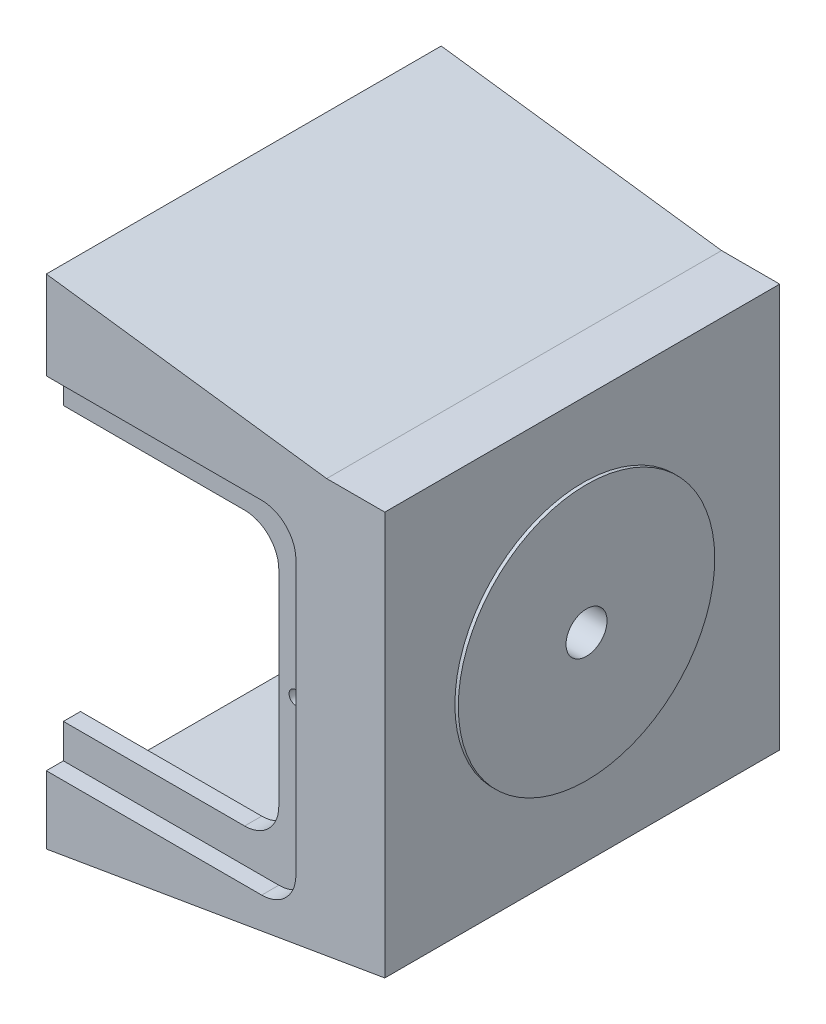
ISO-10303-21;
HEADER;
FILE_DESCRIPTION(('STEP AP214'),'2;1');
FILE_NAME('part.step','',(''),(''),'','','');
FILE_SCHEMA(('AUTOMOTIVE_DESIGN { 1 0 10303 214 1 1 1 1 }'));
ENDSEC;
DATA;
#1=APPLICATION_CONTEXT('core data for automotive mechanical design processes');
#2=APPLICATION_PROTOCOL_DEFINITION('international standard','automotive_design',2000,#1);
#3=PRODUCT_CONTEXT('',#1,'mechanical');
#4=PRODUCT('Part','Part','',(#3));
#5=PRODUCT_RELATED_PRODUCT_CATEGORY('part','',(#4));
#6=PRODUCT_DEFINITION_FORMATION('','',#4);
#7=PRODUCT_DEFINITION_CONTEXT('part definition',#1,'design');
#8=PRODUCT_DEFINITION('design','',#6,#7);
#9=PRODUCT_DEFINITION_SHAPE('','',#8);
#10=(LENGTH_UNIT() NAMED_UNIT(*) SI_UNIT(.MILLI.,.METRE.));
#11=(NAMED_UNIT(*) PLANE_ANGLE_UNIT() SI_UNIT($,.RADIAN.));
#12=(NAMED_UNIT(*) SI_UNIT($,.STERADIAN.) SOLID_ANGLE_UNIT());
#13=UNCERTAINTY_MEASURE_WITH_UNIT(LENGTH_MEASURE(1.E-05),#10,'distance_accuracy_value','');
#14=(GEOMETRIC_REPRESENTATION_CONTEXT(3) GLOBAL_UNCERTAINTY_ASSIGNED_CONTEXT((#13)) GLOBAL_UNIT_ASSIGNED_CONTEXT((#10,
#11,#12)) REPRESENTATION_CONTEXT('',''));
#15=CARTESIAN_POINT('',(0.,0.,0.));
#16=DIRECTION('',(0.,0.,1.));
#17=DIRECTION('',(1.,0.,0.));
#18=AXIS2_PLACEMENT_3D('',#15,#16,#17);
#19=CARTESIAN_POINT('',(192.,0.,0.));
#20=DIRECTION('',(1.,0.,0.));
#21=DIRECTION('',(0.,0.,-1.));
#22=AXIS2_PLACEMENT_3D('',#19,#20,#21);
#23=PLANE('',#22);
#24=DIRECTION('',(0.,-1.,0.));
#25=VECTOR('',#24,1.);
#26=CARTESIAN_POINT('',(192.,-88.0000000000001,52.75));
#27=LINE('',#26,#25);
#28=CARTESIAN_POINT('',(192.,1.99999999999996,52.75));
#29=VERTEX_POINT('',#28);
#30=CARTESIAN_POINT('',(192.,-8.00000000000004,52.75));
#31=VERTEX_POINT('',#30);
#32=EDGE_CURVE('E357',#29,#31,#27,.T.);
#33=ORIENTED_EDGE('',*,*,#32,.F.);
#34=DIRECTION('',(0.,0.,-1.));
#35=VECTOR('',#34,1.);
#36=CARTESIAN_POINT('',(192.,1.99999999999996,52.75));
#37=LINE('',#36,#35);
#38=CARTESIAN_POINT('',(192.,1.99999999999996,57.75));
#39=VERTEX_POINT('',#38);
#40=EDGE_CURVE('E356',#39,#29,#37,.T.);
#41=ORIENTED_EDGE('',*,*,#40,.F.);
#42=DIRECTION('',(0.,1.,0.));
#43=VECTOR('',#42,1.);
#44=CARTESIAN_POINT('',(192.,0.,57.75));
#45=LINE('',#44,#43);
#46=CARTESIAN_POINT('',(192.,27.8100248586414,57.75));
#47=VERTEX_POINT('',#46);
#48=EDGE_CURVE('E366',#39,#47,#45,.T.);
#49=ORIENTED_EDGE('',*,*,#48,.T.);
#50=DIRECTION('',(0.,0.,1.));
#51=VECTOR('',#50,1.);
#52=CARTESIAN_POINT('',(192.,27.8100248586414,57.75));
#53=LINE('',#52,#51);
#54=CARTESIAN_POINT('',(192.,27.8100248586414,-57.75));
#55=VERTEX_POINT('',#54);
#56=EDGE_CURVE('E372',#55,#47,#53,.T.);
#57=ORIENTED_EDGE('',*,*,#56,.F.);
#58=DIRECTION('',(0.,1.,0.));
#59=VECTOR('',#58,1.);
#60=CARTESIAN_POINT('',(192.,0.,-57.75));
#61=LINE('',#60,#59);
#62=CARTESIAN_POINT('',(192.,-117.83,-57.75));
#63=VERTEX_POINT('',#62);
#64=EDGE_CURVE('E361',#63,#55,#61,.T.);
#65=ORIENTED_EDGE('',*,*,#64,.F.);
#66=DIRECTION('',(0.,0.,-1.));
#67=VECTOR('',#66,1.);
#68=CARTESIAN_POINT('',(192.,-117.83,57.75));
#69=LINE('',#68,#67);
#70=CARTESIAN_POINT('',(192.,-117.83,57.75));
#71=VERTEX_POINT('',#70);
#72=EDGE_CURVE('E370',#71,#63,#69,.T.);
#73=ORIENTED_EDGE('',*,*,#72,.F.);
#74=CARTESIAN_POINT('',(192.,-98.,57.75));
#75=VERTEX_POINT('',#74);
#76=EDGE_CURVE('E369',#71,#75,#45,.T.);
#77=ORIENTED_EDGE('',*,*,#76,.T.);
#78=DIRECTION('',(0.,0.,1.));
#79=VECTOR('',#78,1.);
#80=CARTESIAN_POINT('',(192.,-98.,52.75));
#81=LINE('',#80,#79);
#82=CARTESIAN_POINT('',(192.,-98.,52.75));
#83=VERTEX_POINT('',#82);
#84=EDGE_CURVE('E354',#83,#75,#81,.T.);
#85=ORIENTED_EDGE('',*,*,#84,.F.);
#86=CARTESIAN_POINT('',(192.,-88.0000000000001,52.75));
#87=VERTEX_POINT('',#86);
#88=EDGE_CURVE('E200',#87,#83,#27,.T.);
#89=ORIENTED_EDGE('',*,*,#88,.F.);
#90=DIRECTION('',(0.,0.,-1.));
#91=VECTOR('',#90,1.);
#92=CARTESIAN_POINT('',(192.,-88.0000000000001,-57.751));
#93=LINE('',#92,#91);
#94=CARTESIAN_POINT('',(192.,-88.0000000000001,47.75));
#95=VERTEX_POINT('',#94);
#96=EDGE_CURVE('E11',#87,#95,#93,.T.);
#97=ORIENTED_EDGE('',*,*,#96,.T.);
#98=DIRECTION('',(0.,1.,0.));
#99=VECTOR('',#98,1.);
#100=CARTESIAN_POINT('',(192.,0.,47.75));
#101=LINE('',#100,#99);
#102=CARTESIAN_POINT('',(192.,-107.686529193614,47.75));
#103=VERTEX_POINT('',#102);
#104=EDGE_CURVE('E57',#103,#95,#101,.T.);
#105=ORIENTED_EDGE('',*,*,#104,.F.);
#106=DIRECTION('',(0.,0.,-1.));
#107=VECTOR('',#106,1.);
#108=CARTESIAN_POINT('',(192.,-107.686529193614,57.75));
#109=LINE('',#108,#107);
#110=CARTESIAN_POINT('',(192.,-107.686529193614,-47.75));
#111=VERTEX_POINT('',#110);
#112=EDGE_CURVE('E363',#103,#111,#109,.T.);
#113=ORIENTED_EDGE('',*,*,#112,.T.);
#114=DIRECTION('',(0.,1.,0.));
#115=VECTOR('',#114,1.);
#116=CARTESIAN_POINT('',(192.,0.,-47.75));
#117=LINE('',#116,#115);
#118=CARTESIAN_POINT('',(192.,17.7235039722908,-47.75));
#119=VERTEX_POINT('',#118);
#120=EDGE_CURVE('E49',#111,#119,#117,.T.);
#121=ORIENTED_EDGE('',*,*,#120,.T.);
#122=DIRECTION('',(0.,0.,1.));
#123=VECTOR('',#122,1.);
#124=CARTESIAN_POINT('',(192.,17.7235039722908,57.75));
#125=LINE('',#124,#123);
#126=CARTESIAN_POINT('',(192.,17.7235039722908,47.75));
#127=VERTEX_POINT('',#126);
#128=EDGE_CURVE('E365',#119,#127,#125,.T.);
#129=ORIENTED_EDGE('',*,*,#128,.T.);
#130=CARTESIAN_POINT('',(192.,-8.00000000000004,47.75));
#131=VERTEX_POINT('',#130);
#132=EDGE_CURVE('E362',#131,#127,#101,.T.);
#133=ORIENTED_EDGE('',*,*,#132,.F.);
#134=DIRECTION('',(0.,0.,-1.));
#135=VECTOR('',#134,1.);
#136=CARTESIAN_POINT('',(192.,-8.00000000000004,-57.751));
#137=LINE('',#136,#135);
#138=EDGE_CURVE('E44',#31,#131,#137,.T.);
#139=ORIENTED_EDGE('',*,*,#138,.F.);
#140=EDGE_LOOP('',(#33,#41,#49,#57,#65,#73,#77,#85,#89,#97,#105,#113,#121,#129,#133,#139));
#141=FACE_BOUND('',#140,.T.);
#142=ADVANCED_FACE('F41',(#141),#23,.F.);
#143=CARTESIAN_POINT('',(-73.001,-42.,-0.25));
#144=DIRECTION('',(1.,0.,0.));
#145=DIRECTION('',(0.,0.,-1.));
#146=AXIS2_PLACEMENT_3D('',#143,#144,#145);
#147=CYLINDRICAL_SURFACE('',#146,6.);
#148=CARTESIAN_POINT('',(292.,-42.,-0.25));
#149=DIRECTION('',(1.,0.,0.));
#150=DIRECTION('',(0.,0.,-1.));
#151=AXIS2_PLACEMENT_3D('',#148,#149,#150);
#152=CIRCLE('',#151,6.);
#153=CARTESIAN_POINT('',(292.,-42.,-6.25));
#154=VERTEX_POINT('',#153);
#155=EDGE_CURVE('E280',#154,#154,#152,.T.);
#156=CARTESIAN_POINT('',(282.,-42.,-0.25));
#157=DIRECTION('',(1.,0.,0.));
#158=DIRECTION('',(0.,0.,-1.));
#159=AXIS2_PLACEMENT_3D('',#156,#157,#158);
#160=CIRCLE('',#159,6.);
#161=CARTESIAN_POINT('',(282.,-42.,-6.25));
#162=VERTEX_POINT('',#161);
#163=EDGE_CURVE('E283',#162,#162,#160,.F.);
#164=CARTESIAN_POINT('',(292.,-42.,-6.25));
#165=CARTESIAN_POINT('',(291.895833333333,-42.,-6.25));
#166=CARTESIAN_POINT('',(291.791666666667,-42.,-6.25));
#167=CARTESIAN_POINT('',(291.583333333333,-42.,-6.25));
#168=CARTESIAN_POINT('',(291.479166666667,-42.,-6.25));
#169=CARTESIAN_POINT('',(291.270833333333,-42.,-6.25));
#170=CARTESIAN_POINT('',(291.166666666667,-42.,-6.25));
#171=CARTESIAN_POINT('',(290.958333333333,-42.,-6.25));
#172=CARTESIAN_POINT('',(290.854166666667,-42.,-6.25));
#173=CARTESIAN_POINT('',(290.645833333333,-42.,-6.25));
#174=CARTESIAN_POINT('',(290.541666666667,-42.,-6.25));
#175=CARTESIAN_POINT('',(290.333333333333,-42.,-6.25));
#176=CARTESIAN_POINT('',(290.229166666667,-42.,-6.25));
#177=CARTESIAN_POINT('',(290.020833333333,-42.,-6.25));
#178=CARTESIAN_POINT('',(289.916666666667,-42.,-6.25));
#179=CARTESIAN_POINT('',(289.708333333333,-42.,-6.25));
#180=CARTESIAN_POINT('',(289.604166666667,-42.,-6.25));
#181=CARTESIAN_POINT('',(289.395833333333,-42.,-6.25));
#182=CARTESIAN_POINT('',(289.291666666667,-42.,-6.25));
#183=CARTESIAN_POINT('',(289.083333333333,-42.,-6.25));
#184=CARTESIAN_POINT('',(288.979166666667,-42.,-6.25));
#185=CARTESIAN_POINT('',(288.770833333333,-42.,-6.25));
#186=CARTESIAN_POINT('',(288.666666666667,-42.,-6.25));
#187=CARTESIAN_POINT('',(288.458333333333,-42.,-6.25));
#188=CARTESIAN_POINT('',(288.354166666667,-42.,-6.25));
#189=CARTESIAN_POINT('',(288.145833333333,-42.,-6.25));
#190=CARTESIAN_POINT('',(288.041666666667,-42.,-6.25));
#191=CARTESIAN_POINT('',(287.833333333333,-42.,-6.25));
#192=CARTESIAN_POINT('',(287.729166666667,-42.,-6.25));
#193=CARTESIAN_POINT('',(287.520833333333,-42.,-6.25));
#194=CARTESIAN_POINT('',(287.416666666667,-42.,-6.25));
#195=CARTESIAN_POINT('',(287.208333333333,-42.,-6.25));
#196=CARTESIAN_POINT('',(287.104166666667,-42.,-6.25));
#197=CARTESIAN_POINT('',(286.895833333333,-42.,-6.25));
#198=CARTESIAN_POINT('',(286.791666666667,-42.,-6.25));
#199=CARTESIAN_POINT('',(286.583333333333,-42.,-6.25));
#200=CARTESIAN_POINT('',(286.479166666667,-42.,-6.25));
#201=CARTESIAN_POINT('',(286.270833333333,-42.,-6.25));
#202=CARTESIAN_POINT('',(286.166666666667,-42.,-6.25));
#203=CARTESIAN_POINT('',(285.958333333333,-42.,-6.25));
#204=CARTESIAN_POINT('',(285.854166666667,-42.,-6.25));
#205=CARTESIAN_POINT('',(285.645833333333,-42.,-6.25));
#206=CARTESIAN_POINT('',(285.541666666667,-42.,-6.25));
#207=CARTESIAN_POINT('',(285.333333333333,-42.,-6.25));
#208=CARTESIAN_POINT('',(285.229166666667,-42.,-6.25));
#209=CARTESIAN_POINT('',(285.020833333333,-42.,-6.25));
#210=CARTESIAN_POINT('',(284.916666666667,-42.,-6.25));
#211=CARTESIAN_POINT('',(284.708333333333,-42.,-6.25));
#212=CARTESIAN_POINT('',(284.604166666667,-42.,-6.25));
#213=CARTESIAN_POINT('',(284.395833333333,-42.,-6.25));
#214=CARTESIAN_POINT('',(284.291666666667,-42.,-6.25));
#215=CARTESIAN_POINT('',(284.083333333333,-42.,-6.25));
#216=CARTESIAN_POINT('',(283.979166666667,-42.,-6.25));
#217=CARTESIAN_POINT('',(283.770833333333,-42.,-6.25));
#218=CARTESIAN_POINT('',(283.666666666667,-42.,-6.25));
#219=CARTESIAN_POINT('',(283.458333333333,-42.,-6.25));
#220=CARTESIAN_POINT('',(283.354166666667,-42.,-6.25));
#221=CARTESIAN_POINT('',(283.145833333333,-42.,-6.25));
#222=CARTESIAN_POINT('',(283.041666666667,-42.,-6.25));
#223=CARTESIAN_POINT('',(282.833333333333,-42.,-6.25));
#224=CARTESIAN_POINT('',(282.729166666667,-42.,-6.25));
#225=CARTESIAN_POINT('',(282.520833333333,-42.,-6.25));
#226=CARTESIAN_POINT('',(282.416666666667,-42.,-6.25));
#227=CARTESIAN_POINT('',(282.208333333333,-42.,-6.25));
#228=CARTESIAN_POINT('',(282.104166666667,-42.,-6.25));
#229=CARTESIAN_POINT('',(282.,-42.,-6.25));
#230=B_SPLINE_CURVE_WITH_KNOTS('',3,(#164,#165,#166,#167,#168,#169,#170,#171,#172,#173,#174,
#175,#176,#177,#178,#179,#180,#181,#182,#183,#184,#185,#186,#187,#188,#189,#190,#191,#192,#193,
#194,#195,#196,#197,#198,#199,#200,#201,#202,#203,#204,#205,#206,#207,#208,#209,#210,#211,#212,
#213,#214,#215,#216,#217,#218,#219,#220,#221,#222,#223,#224,#225,#226,#227,#228,#229),
.UNSPECIFIED.,.F.,.F.,(4,2,2,2,2,2,2,2,2,2,2,2,2,2,2,2,2,2,2,2,2,2,2,2,2,2,2,2,2,2,2,2,4),(0.,
0.312499999999993,0.624999999999987,0.93749999999998,1.24999999999997,1.56250000000002,
1.87500000000002,2.18750000000001,2.5,2.8125,3.12499999999999,3.43749999999998,3.75000000000003,
4.06250000000002,4.37500000000002,4.68750000000001,5.,5.3125,5.62499999999999,5.93749999999998,
6.24999999999998,6.56250000000003,6.87500000000002,7.18750000000001,7.50000000000001,7.8125,
8.12499999999999,8.43749999999999,8.75000000000004,9.06250000000003,9.37500000000002,
9.68750000000002,10.),.UNSPECIFIED.);
#231=EDGE_CURVE('BSEAM430',#154,#162,#230,.T.);
#232=ORIENTED_EDGE('',*,*,#155,.T.);
#233=ORIENTED_EDGE('',*,*,#163,.T.);
#234=ORIENTED_EDGE('',*,*,#231,.T.);
#235=ORIENTED_EDGE('',*,*,#231,.F.);
#236=EDGE_LOOP('',(#232,#234,#233,#235));
#237=FACE_BOUND('',#236,.T.);
#238=ADVANCED_FACE('F430',(#237),#147,.F.);
#239=CARTESIAN_POINT('',(292.,-42.,-0.25));
#240=DIRECTION('',(1.,0.,0.));
#241=DIRECTION('',(0.,0.,-1.));
#242=AXIS2_PLACEMENT_3D('',#239,#240,#241);
#243=PLANE('',#242);
#244=ORIENTED_EDGE('',*,*,#155,.F.);
#245=EDGE_LOOP('',(#244));
#246=FACE_BOUND('',#245,.T.);
#247=CARTESIAN_POINT('',(292.,-42.,-0.25));
#248=DIRECTION('',(1.,0.,0.));
#249=DIRECTION('',(0.,0.,-1.));
#250=AXIS2_PLACEMENT_3D('',#247,#248,#249);
#251=CIRCLE('',#250,37.5);
#252=CARTESIAN_POINT('',(292.,-42.,-37.75));
#253=VERTEX_POINT('',#252);
#254=EDGE_CURVE('E286',#253,#253,#251,.T.);
#255=ORIENTED_EDGE('',*,*,#254,.T.);
#256=EDGE_LOOP('',(#255));
#257=FACE_BOUND('',#256,.T.);
#258=ADVANCED_FACE('F434',(#246,#257),#243,.T.);
#259=CARTESIAN_POINT('',(282.,-42.,-0.25));
#260=DIRECTION('',(1.,0.,0.));
#261=DIRECTION('',(0.,0.,-1.));
#262=AXIS2_PLACEMENT_3D('',#259,#260,#261);
#263=PLANE('',#262);
#264=ORIENTED_EDGE('',*,*,#163,.F.);
#265=EDGE_LOOP('',(#264));
#266=FACE_BOUND('',#265,.T.);
#267=CARTESIAN_POINT('',(282.,-42.,-0.25));
#268=DIRECTION('',(1.,0.,0.));
#269=DIRECTION('',(0.,0.,-1.));
#270=AXIS2_PLACEMENT_3D('',#267,#268,#269);
#271=CIRCLE('',#270,27.5);
#272=CARTESIAN_POINT('',(282.,-42.,-27.75));
#273=VERTEX_POINT('',#272);
#274=EDGE_CURVE('E320',#273,#273,#271,.T.);
#275=ORIENTED_EDGE('',*,*,#274,.F.);
#276=EDGE_LOOP('',(#275));
#277=FACE_BOUND('',#276,.T.);
#278=ADVANCED_FACE('F506',(#266,#277),#263,.F.);
#279=CARTESIAN_POINT('',(292.,-42.,-0.25));
#280=DIRECTION('',(-1.,0.,0.));
#281=DIRECTION('',(0.,0.,1.));
#282=AXIS2_PLACEMENT_3D('',#279,#280,#281);
#283=CYLINDRICAL_SURFACE('',#282,37.5);
#284=ORIENTED_EDGE('',*,*,#254,.F.);
#285=EDGE_LOOP('',(#284));
#286=FACE_BOUND('',#285,.T.);
#287=CARTESIAN_POINT('',(291.,-42.,-0.25));
#288=DIRECTION('',(-1.,0.,0.));
#289=DIRECTION('',(0.,0.,1.));
#290=AXIS2_PLACEMENT_3D('',#287,#288,#289);
#291=CIRCLE('',#290,37.5);
#292=CARTESIAN_POINT('',(291.,-42.,37.25));
#293=VERTEX_POINT('',#292);
#294=EDGE_CURVE('E316',#293,#293,#291,.F.);
#295=ORIENTED_EDGE('',*,*,#294,.T.);
#296=EDGE_LOOP('',(#295));
#297=FACE_BOUND('',#296,.T.);
#298=ADVANCED_FACE('F508',(#286,#297),#283,.T.);
#299=CARTESIAN_POINT('',(292.,-42.,-0.25));
#300=DIRECTION('',(-1.,0.,0.));
#301=DIRECTION('',(0.,0.,1.));
#302=AXIS2_PLACEMENT_3D('',#299,#300,#301);
#303=CYLINDRICAL_SURFACE('',#302,27.5);
#304=ORIENTED_EDGE('',*,*,#274,.T.);
#305=EDGE_LOOP('',(#304));
#306=FACE_BOUND('',#305,.T.);
#307=CARTESIAN_POINT('',(281.,-42.,-0.25));
#308=DIRECTION('',(-1.,0.,0.));
#309=DIRECTION('',(0.,0.,1.));
#310=AXIS2_PLACEMENT_3D('',#307,#308,#309);
#311=CIRCLE('',#310,27.5);
#312=CARTESIAN_POINT('',(281.,-42.,27.25));
#313=VERTEX_POINT('',#312);
#314=EDGE_CURVE('E324',#313,#313,#311,.F.);
#315=ORIENTED_EDGE('',*,*,#314,.F.);
#316=EDGE_LOOP('',(#315));
#317=FACE_BOUND('',#316,.T.);
#318=ADVANCED_FACE('F511',(#306,#317),#303,.F.);
#319=CARTESIAN_POINT('',(291.,0.,57.75));
#320=DIRECTION('',(-1.,0.,0.));
#321=DIRECTION('',(0.,0.,1.));
#322=AXIS2_PLACEMENT_3D('',#319,#320,#321);
#323=PLANE('',#322);
#324=ORIENTED_EDGE('',*,*,#294,.F.);
#325=EDGE_LOOP('',(#324));
#326=FACE_BOUND('',#325,.T.);
#327=DIRECTION('',(0.,1.,0.));
#328=VECTOR('',#327,1.);
#329=CARTESIAN_POINT('',(291.,0.,-57.75));
#330=LINE('',#329,#328);
#331=CARTESIAN_POINT('',(291.,-101.,-57.75));
#332=VERTEX_POINT('',#331);
#333=CARTESIAN_POINT('',(291.,17.,-57.75));
#334=VERTEX_POINT('',#333);
#335=EDGE_CURVE('E302',#332,#334,#330,.T.);
#336=ORIENTED_EDGE('',*,*,#335,.T.);
#337=DIRECTION('',(0.,0.,-1.));
#338=VECTOR('',#337,1.);
#339=CARTESIAN_POINT('',(291.,17.,57.75));
#340=LINE('',#339,#338);
#341=CARTESIAN_POINT('',(291.,17.,57.75));
#342=VERTEX_POINT('',#341);
#343=EDGE_CURVE('E310',#342,#334,#340,.T.);
#344=ORIENTED_EDGE('',*,*,#343,.F.);
#345=DIRECTION('',(0.,1.,0.));
#346=VECTOR('',#345,1.);
#347=CARTESIAN_POINT('',(291.,0.,57.75));
#348=LINE('',#347,#346);
#349=CARTESIAN_POINT('',(291.,-101.,57.75));
#350=VERTEX_POINT('',#349);
#351=EDGE_CURVE('E292',#350,#342,#348,.T.);
#352=ORIENTED_EDGE('',*,*,#351,.F.);
#353=DIRECTION('',(0.,0.,-1.));
#354=VECTOR('',#353,1.);
#355=CARTESIAN_POINT('',(291.,-101.,57.75));
#356=LINE('',#355,#354);
#357=EDGE_CURVE('E313',#350,#332,#356,.T.);
#358=ORIENTED_EDGE('',*,*,#357,.T.);
#359=EDGE_LOOP('',(#336,#344,#352,#358));
#360=FACE_BOUND('',#359,.T.);
#361=ADVANCED_FACE('F522',(#326,#360),#323,.F.);
#362=CARTESIAN_POINT('',(291.,17.,57.75));
#363=DIRECTION('',(0.,-1.,0.));
#364=DIRECTION('',(1.,0.,0.));
#365=AXIS2_PLACEMENT_3D('',#362,#363,#364);
#366=PLANE('',#365);
#367=DIRECTION('',(-1.,0.,0.));
#368=VECTOR('',#367,1.);
#369=CARTESIAN_POINT('',(291.,17.,-57.75));
#370=LINE('',#369,#368);
#371=CARTESIAN_POINT('',(274.,17.,-57.75));
#372=VERTEX_POINT('',#371);
#373=EDGE_CURVE('E304',#334,#372,#370,.T.);
#374=ORIENTED_EDGE('',*,*,#373,.T.);
#375=DIRECTION('',(0.,0.,-1.));
#376=VECTOR('',#375,1.);
#377=CARTESIAN_POINT('',(274.,17.,57.75));
#378=LINE('',#377,#376);
#379=CARTESIAN_POINT('',(274.,17.,57.75));
#380=VERTEX_POINT('',#379);
#381=EDGE_CURVE('E300',#380,#372,#378,.T.);
#382=ORIENTED_EDGE('',*,*,#381,.F.);
#383=DIRECTION('',(-1.,0.,0.));
#384=VECTOR('',#383,1.);
#385=CARTESIAN_POINT('',(291.,17.,57.75));
#386=LINE('',#385,#384);
#387=EDGE_CURVE('E295',#342,#380,#386,.T.);
#388=ORIENTED_EDGE('',*,*,#387,.F.);
#389=ORIENTED_EDGE('',*,*,#343,.T.);
#390=EDGE_LOOP('',(#374,#382,#388,#389));
#391=FACE_BOUND('',#390,.T.);
#392=ADVANCED_FACE('F519',(#391),#366,.F.);
#393=CARTESIAN_POINT('',(274.,17.,57.75));
#394=DIRECTION('',(-0.130698754240664,-0.991422127874872,0.));
#395=DIRECTION('',(0.991422127874872,-0.130698754240664,0.));
#396=AXIS2_PLACEMENT_3D('',#393,#394,#395);
#397=PLANE('',#396);
#398=DIRECTION('',(-0.991422127874872,0.130698754240664,0.));
#399=VECTOR('',#398,1.);
#400=CARTESIAN_POINT('',(274.,17.,-57.75));
#401=LINE('',#400,#399);
#402=EDGE_CURVE('E293',#372,#55,#401,.T.);
#403=ORIENTED_EDGE('',*,*,#402,.T.);
#404=ORIENTED_EDGE('',*,*,#56,.T.);
#405=DIRECTION('',(-0.991422127874872,0.130698754240664,0.));
#406=VECTOR('',#405,1.);
#407=CARTESIAN_POINT('',(274.,17.,57.75));
#408=LINE('',#407,#406);
#409=EDGE_CURVE('E297',#380,#47,#408,.T.);
#410=ORIENTED_EDGE('',*,*,#409,.F.);
#411=ORIENTED_EDGE('',*,*,#381,.T.);
#412=EDGE_LOOP('',(#403,#404,#410,#411));
#413=FACE_BOUND('',#412,.T.);
#414=ADVANCED_FACE('F399',(#413),#397,.F.);
#415=CARTESIAN_POINT('',(291.,-101.,57.75));
#416=DIRECTION('',(-0.167595493933869,0.985855846669817,0.));
#417=DIRECTION('',(-0.985855846669818,-0.167595493933869,0.));
#418=AXIS2_PLACEMENT_3D('',#415,#416,#417);
#419=PLANE('',#418);
#420=DIRECTION('',(0.985855846669817,0.167595493933869,0.));
#421=VECTOR('',#420,1.);
#422=CARTESIAN_POINT('',(291.,-101.,57.75));
#423=LINE('',#422,#421);
#424=EDGE_CURVE('E290',#71,#350,#423,.T.);
#425=ORIENTED_EDGE('',*,*,#424,.F.);
#426=ORIENTED_EDGE('',*,*,#72,.T.);
#427=DIRECTION('',(0.985855846669817,0.167595493933869,0.));
#428=VECTOR('',#427,1.);
#429=CARTESIAN_POINT('',(291.,-101.,-57.75));
#430=LINE('',#429,#428);
#431=EDGE_CURVE('E289',#63,#332,#430,.T.);
#432=ORIENTED_EDGE('',*,*,#431,.T.);
#433=ORIENTED_EDGE('',*,*,#357,.F.);
#434=EDGE_LOOP('',(#425,#426,#432,#433));
#435=FACE_BOUND('',#434,.T.);
#436=ADVANCED_FACE('F408',(#435),#419,.F.);
#437=CARTESIAN_POINT('',(0.,0.,-57.75));
#438=DIRECTION('',(0.,0.,1.));
#439=DIRECTION('',(1.,0.,0.));
#440=AXIS2_PLACEMENT_3D('',#437,#438,#439);
#441=PLANE('',#440);
#442=ORIENTED_EDGE('',*,*,#431,.F.);
#443=ORIENTED_EDGE('',*,*,#64,.T.);
#444=ORIENTED_EDGE('',*,*,#402,.F.);
#445=ORIENTED_EDGE('',*,*,#373,.F.);
#446=ORIENTED_EDGE('',*,*,#335,.F.);
#447=EDGE_LOOP('',(#442,#443,#444,#445,#446));
#448=FACE_BOUND('',#447,.T.);
#449=ADVANCED_FACE('F403',(#448),#441,.F.);
#450=CARTESIAN_POINT('',(272.693012457593,7.08577872125128,57.75));
#451=DIRECTION('',(-0.130698754240664,-0.991422127874872,0.));
#452=DIRECTION('',(0.991422127874872,-0.130698754240664,0.));
#453=AXIS2_PLACEMENT_3D('',#450,#451,#452);
#454=PLANE('',#453);
#455=ORIENTED_EDGE('',*,*,#128,.F.);
#456=DIRECTION('',(-0.991422127874872,0.130698754240664,0.));
#457=VECTOR('',#456,1.);
#458=CARTESIAN_POINT('',(272.693012457593,7.08577872125128,-47.75));
#459=LINE('',#458,#457);
#460=CARTESIAN_POINT('',(273.343691363015,6.99999999999999,-47.75));
#461=VERTEX_POINT('',#460);
#462=EDGE_CURVE('E339',#461,#119,#459,.T.);
#463=ORIENTED_EDGE('',*,*,#462,.F.);
#464=DIRECTION('',(0.,0.,-1.));
#465=VECTOR('',#464,1.);
#466=CARTESIAN_POINT('',(273.343691363015,6.99999999999999,57.75));
#467=LINE('',#466,#465);
#468=CARTESIAN_POINT('',(273.343691363015,6.99999999999999,47.75));
#469=VERTEX_POINT('',#468);
#470=EDGE_CURVE('E336',#469,#461,#467,.T.);
#471=ORIENTED_EDGE('',*,*,#470,.F.);
#472=DIRECTION('',(-0.991422127874872,0.130698754240664,0.));
#473=VECTOR('',#472,1.);
#474=CARTESIAN_POINT('',(272.693012457593,7.08577872125128,47.75));
#475=LINE('',#474,#473);
#476=EDGE_CURVE('E327',#469,#127,#475,.T.);
#477=ORIENTED_EDGE('',*,*,#476,.T.);
#478=EDGE_LOOP('',(#455,#463,#471,#477));
#479=FACE_BOUND('',#478,.T.);
#480=ADVANCED_FACE('F484',(#479),#454,.T.);
#481=CARTESIAN_POINT('',(291.,7.,57.75));
#482=DIRECTION('',(0.,-1.,0.));
#483=DIRECTION('',(1.,0.,0.));
#484=AXIS2_PLACEMENT_3D('',#481,#482,#483);
#485=PLANE('',#484);
#486=DIRECTION('',(-1.,0.,0.));
#487=VECTOR('',#486,1.);
#488=CARTESIAN_POINT('',(291.,7.,-47.75));
#489=LINE('',#488,#487);
#490=CARTESIAN_POINT('',(281.,7.,-47.75));
#491=VERTEX_POINT('',#490);
#492=EDGE_CURVE('E344',#491,#461,#489,.T.);
#493=ORIENTED_EDGE('',*,*,#492,.F.);
#494=DIRECTION('',(0.,0.,-1.));
#495=VECTOR('',#494,1.);
#496=CARTESIAN_POINT('',(281.,7.,57.75));
#497=LINE('',#496,#495);
#498=CARTESIAN_POINT('',(281.,7.,47.75));
#499=VERTEX_POINT('',#498);
#500=EDGE_CURVE('E341',#499,#491,#497,.T.);
#501=ORIENTED_EDGE('',*,*,#500,.F.);
#502=DIRECTION('',(-1.,0.,0.));
#503=VECTOR('',#502,1.);
#504=CARTESIAN_POINT('',(291.,7.,47.75));
#505=LINE('',#504,#503);
#506=EDGE_CURVE('E330',#499,#469,#505,.T.);
#507=ORIENTED_EDGE('',*,*,#506,.T.);
#508=ORIENTED_EDGE('',*,*,#470,.T.);
#509=EDGE_LOOP('',(#493,#501,#507,#508));
#510=FACE_BOUND('',#509,.T.);
#511=ADVANCED_FACE('F481',(#510),#485,.T.);
#512=CARTESIAN_POINT('',(281.,0.,57.75));
#513=DIRECTION('',(-1.,0.,0.));
#514=DIRECTION('',(0.,0.,1.));
#515=AXIS2_PLACEMENT_3D('',#512,#513,#514);
#516=PLANE('',#515);
#517=ORIENTED_EDGE('',*,*,#314,.T.);
#518=EDGE_LOOP('',(#517));
#519=FACE_BOUND('',#518,.T.);
#520=DIRECTION('',(0.,1.,0.));
#521=VECTOR('',#520,1.);
#522=CARTESIAN_POINT('',(281.,0.,-47.75));
#523=LINE('',#522,#521);
#524=CARTESIAN_POINT('',(281.,-92.5565291936143,-47.75));
#525=VERTEX_POINT('',#524);
#526=EDGE_CURVE('E349',#525,#491,#523,.T.);
#527=ORIENTED_EDGE('',*,*,#526,.F.);
#528=DIRECTION('',(0.,0.,-1.));
#529=VECTOR('',#528,1.);
#530=CARTESIAN_POINT('',(281.,-92.5565291936143,57.75));
#531=LINE('',#530,#529);
#532=CARTESIAN_POINT('',(281.,-92.5565291936143,47.75));
#533=VERTEX_POINT('',#532);
#534=EDGE_CURVE('E346',#533,#525,#531,.T.);
#535=ORIENTED_EDGE('',*,*,#534,.F.);
#536=DIRECTION('',(0.,1.,0.));
#537=VECTOR('',#536,1.);
#538=CARTESIAN_POINT('',(281.,0.,47.75));
#539=LINE('',#538,#537);
#540=EDGE_CURVE('E332',#533,#499,#539,.T.);
#541=ORIENTED_EDGE('',*,*,#540,.T.);
#542=ORIENTED_EDGE('',*,*,#500,.T.);
#543=EDGE_LOOP('',(#527,#535,#541,#542));
#544=FACE_BOUND('',#543,.T.);
#545=ADVANCED_FACE('F475',(#519,#544),#516,.T.);
#546=CARTESIAN_POINT('',(289.324045060661,-91.1414415333018,57.75));
#547=DIRECTION('',(-0.167595493933869,0.985855846669817,0.));
#548=DIRECTION('',(-0.985855846669818,-0.167595493933869,0.));
#549=AXIS2_PLACEMENT_3D('',#546,#547,#548);
#550=PLANE('',#549);
#551=ORIENTED_EDGE('',*,*,#112,.F.);
#552=DIRECTION('',(0.985855846669818,0.167595493933869,0.));
#553=VECTOR('',#552,1.);
#554=CARTESIAN_POINT('',(289.324045060661,-91.1414415333018,47.75));
#555=LINE('',#554,#553);
#556=EDGE_CURVE('E334',#103,#533,#555,.T.);
#557=ORIENTED_EDGE('',*,*,#556,.T.);
#558=ORIENTED_EDGE('',*,*,#534,.T.);
#559=DIRECTION('',(0.985855846669818,0.167595493933869,0.));
#560=VECTOR('',#559,1.);
#561=CARTESIAN_POINT('',(289.324045060661,-91.1414415333018,-47.75));
#562=LINE('',#561,#560);
#563=EDGE_CURVE('E319',#111,#525,#562,.T.);
#564=ORIENTED_EDGE('',*,*,#563,.F.);
#565=EDGE_LOOP('',(#551,#557,#558,#564));
#566=FACE_BOUND('',#565,.T.);
#567=ADVANCED_FACE('F471',(#566),#550,.T.);
#568=CARTESIAN_POINT('',(0.,0.,-47.75));
#569=DIRECTION('',(0.,0.,1.));
#570=DIRECTION('',(1.,0.,0.));
#571=AXIS2_PLACEMENT_3D('',#568,#569,#570);
#572=PLANE('',#571);
#573=ORIENTED_EDGE('',*,*,#120,.F.);
#574=ORIENTED_EDGE('',*,*,#563,.T.);
#575=ORIENTED_EDGE('',*,*,#526,.T.);
#576=ORIENTED_EDGE('',*,*,#492,.T.);
#577=ORIENTED_EDGE('',*,*,#462,.T.);
#578=EDGE_LOOP('',(#573,#574,#575,#576,#577));
#579=FACE_BOUND('',#578,.T.);
#580=ADVANCED_FACE('F424',(#579),#572,.T.);
#581=CARTESIAN_POINT('',(0.,0.,47.75));
#582=DIRECTION('',(0.,0.,1.));
#583=DIRECTION('',(1.,0.,0.));
#584=AXIS2_PLACEMENT_3D('',#581,#582,#583);
#585=PLANE('',#584);
#586=CARTESIAN_POINT('',(260.,-48.,47.75));
#587=DIRECTION('',(0.,0.,1.));
#588=DIRECTION('',(1.,0.,0.));
#589=AXIS2_PLACEMENT_3D('',#586,#587,#588);
#590=CIRCLE('',#589,2.);
#591=CARTESIAN_POINT('',(262.,-48.,47.75));
#592=VERTEX_POINT('',#591);
#593=EDGE_CURVE('E462',#592,#592,#590,.T.);
#594=ORIENTED_EDGE('',*,*,#593,.T.);
#595=EDGE_LOOP('',(#594));
#596=FACE_BOUND('',#595,.T.);
#597=ORIENTED_EDGE('',*,*,#556,.F.);
#598=ORIENTED_EDGE('',*,*,#104,.T.);
#599=DIRECTION('',(1.,0.,0.));
#600=VECTOR('',#599,1.);
#601=CARTESIAN_POINT('',(0.,-88.0000000000001,47.75));
#602=LINE('',#601,#600);
#603=CARTESIAN_POINT('',(245.,-88.,47.75));
#604=VERTEX_POINT('',#603);
#605=EDGE_CURVE('E257',#95,#604,#602,.T.);
#606=ORIENTED_EDGE('',*,*,#605,.T.);
#607=CARTESIAN_POINT('',(245.,-78.,47.75));
#608=DIRECTION('',(0.,0.,1.));
#609=DIRECTION('',(1.,0.,0.));
#610=AXIS2_PLACEMENT_3D('',#607,#608,#609);
#611=CIRCLE('',#610,10.);
#612=CARTESIAN_POINT('',(255.,-78.,47.75));
#613=VERTEX_POINT('',#612);
#614=EDGE_CURVE('E259',#613,#604,#611,.F.);
#615=ORIENTED_EDGE('',*,*,#614,.F.);
#616=DIRECTION('',(0.,-1.,0.));
#617=VECTOR('',#616,1.);
#618=CARTESIAN_POINT('',(255.,0.,47.75));
#619=LINE('',#618,#617);
#620=CARTESIAN_POINT('',(255.,-18.,47.75));
#621=VERTEX_POINT('',#620);
#622=EDGE_CURVE('E262',#621,#613,#619,.T.);
#623=ORIENTED_EDGE('',*,*,#622,.F.);
#624=CARTESIAN_POINT('',(245.,-18.,47.75));
#625=DIRECTION('',(0.,0.,1.));
#626=DIRECTION('',(1.,0.,0.));
#627=AXIS2_PLACEMENT_3D('',#624,#625,#626);
#628=CIRCLE('',#627,10.);
#629=CARTESIAN_POINT('',(245.,-8.00000000000003,47.75));
#630=VERTEX_POINT('',#629);
#631=EDGE_CURVE('E269',#630,#621,#628,.F.);
#632=ORIENTED_EDGE('',*,*,#631,.F.);
#633=DIRECTION('',(1.,0.,0.));
#634=VECTOR('',#633,1.);
#635=CARTESIAN_POINT('',(0.,-8.00000000000006,47.75));
#636=LINE('',#635,#634);
#637=EDGE_CURVE('E255',#131,#630,#636,.T.);
#638=ORIENTED_EDGE('',*,*,#637,.F.);
#639=ORIENTED_EDGE('',*,*,#132,.T.);
#640=ORIENTED_EDGE('',*,*,#476,.F.);
#641=ORIENTED_EDGE('',*,*,#506,.F.);
#642=ORIENTED_EDGE('',*,*,#540,.F.);
#643=EDGE_LOOP('',(#597,#598,#606,#615,#623,#632,#638,#639,#640,#641,#642));
#644=FACE_BOUND('',#643,.T.);
#645=ADVANCED_FACE('F415',(#596,#644),#585,.F.);
#646=CARTESIAN_POINT('',(265.,-88.,52.75));
#647=DIRECTION('',(1.,0.,0.));
#648=DIRECTION('',(0.,0.,-1.));
#649=AXIS2_PLACEMENT_3D('',#646,#647,#648);
#650=PLANE('',#649);
#651=DIRECTION('',(0.,1.,0.));
#652=VECTOR('',#651,1.);
#653=CARTESIAN_POINT('',(265.,-88.,57.75));
#654=LINE('',#653,#652);
#655=CARTESIAN_POINT('',(265.,-88.,57.75));
#656=VERTEX_POINT('',#655);
#657=CARTESIAN_POINT('',(265.,-8.0000000000001,57.75));
#658=VERTEX_POINT('',#657);
#659=EDGE_CURVE('E231',#656,#658,#654,.T.);
#660=ORIENTED_EDGE('',*,*,#659,.T.);
#661=DIRECTION('',(0.,0.,1.));
#662=VECTOR('',#661,1.);
#663=CARTESIAN_POINT('',(265.,-8.0000000000001,52.75));
#664=LINE('',#663,#662);
#665=CARTESIAN_POINT('',(265.,-8.0000000000001,52.75));
#666=VERTEX_POINT('',#665);
#667=EDGE_CURVE('E242',#666,#658,#664,.T.);
#668=ORIENTED_EDGE('',*,*,#667,.F.);
#669=DIRECTION('',(0.,1.,0.));
#670=VECTOR('',#669,1.);
#671=CARTESIAN_POINT('',(265.,-88.,52.75));
#672=LINE('',#671,#670);
#673=CARTESIAN_POINT('',(265.,-88.,52.75));
#674=VERTEX_POINT('',#673);
#675=EDGE_CURVE('E218',#674,#666,#672,.T.);
#676=ORIENTED_EDGE('',*,*,#675,.F.);
#677=DIRECTION('',(0.,0.,1.));
#678=VECTOR('',#677,1.);
#679=CARTESIAN_POINT('',(265.,-88.,52.75));
#680=LINE('',#679,#678);
#681=EDGE_CURVE('E213',#674,#656,#680,.T.);
#682=ORIENTED_EDGE('',*,*,#681,.T.);
#683=EDGE_LOOP('',(#660,#668,#676,#682));
#684=FACE_BOUND('',#683,.T.);
#685=ADVANCED_FACE('F412',(#684),#650,.F.);
#686=CARTESIAN_POINT('',(0.,-88.0000000000001,-57.751));
#687=DIRECTION('',(0.,1.,0.));
#688=DIRECTION('',(-1.,0.,0.));
#689=AXIS2_PLACEMENT_3D('',#686,#687,#688);
#690=PLANE('',#689);
#691=ORIENTED_EDGE('',*,*,#96,.F.);
#692=DIRECTION('',(-1.,0.,0.));
#693=VECTOR('',#692,1.);
#694=CARTESIAN_POINT('',(0.,-88.0000000000001,52.75));
#695=LINE('',#694,#693);
#696=CARTESIAN_POINT('',(245.,-88.,52.75));
#697=VERTEX_POINT('',#696);
#698=EDGE_CURVE('E247',#697,#87,#695,.T.);
#699=ORIENTED_EDGE('',*,*,#698,.F.);
#700=DIRECTION('',(0.,0.,1.));
#701=VECTOR('',#700,1.);
#702=CARTESIAN_POINT('',(245.,-88.,-57.751));
#703=LINE('',#702,#701);
#704=EDGE_CURVE('E270',#604,#697,#703,.T.);
#705=ORIENTED_EDGE('',*,*,#704,.F.);
#706=ORIENTED_EDGE('',*,*,#605,.F.);
#707=EDGE_LOOP('',(#691,#699,#705,#706));
#708=FACE_BOUND('',#707,.T.);
#709=ADVANCED_FACE('F414',(#708),#690,.T.);
#710=CARTESIAN_POINT('',(245.,-78.,-57.751));
#711=DIRECTION('',(0.,0.,1.));
#712=DIRECTION('',(1.,0.,0.));
#713=AXIS2_PLACEMENT_3D('',#710,#711,#712);
#714=CYLINDRICAL_SURFACE('',#713,10.);
#715=ORIENTED_EDGE('',*,*,#704,.T.);
#716=CARTESIAN_POINT('',(245.,-78.,52.75));
#717=DIRECTION('',(0.,0.,-1.));
#718=DIRECTION('',(-1.,0.,0.));
#719=AXIS2_PLACEMENT_3D('',#716,#717,#718);
#720=CIRCLE('',#719,10.);
#721=CARTESIAN_POINT('',(255.,-78.,52.75));
#722=VERTEX_POINT('',#721);
#723=EDGE_CURVE('E249',#697,#722,#720,.F.);
#724=ORIENTED_EDGE('',*,*,#723,.T.);
#725=DIRECTION('',(0.,0.,1.));
#726=VECTOR('',#725,1.);
#727=CARTESIAN_POINT('',(255.,-78.,-57.751));
#728=LINE('',#727,#726);
#729=EDGE_CURVE('E266',#613,#722,#728,.T.);
#730=ORIENTED_EDGE('',*,*,#729,.F.);
#731=ORIENTED_EDGE('',*,*,#614,.T.);
#732=EDGE_LOOP('',(#715,#724,#730,#731));
#733=FACE_BOUND('',#732,.T.);
#734=ADVANCED_FACE('F421',(#733),#714,.F.);
#735=CARTESIAN_POINT('',(255.,0.,-57.751));
#736=DIRECTION('',(1.,0.,0.));
#737=DIRECTION('',(0.,0.,-1.));
#738=AXIS2_PLACEMENT_3D('',#735,#736,#737);
#739=PLANE('',#738);
#740=ORIENTED_EDGE('',*,*,#729,.T.);
#741=DIRECTION('',(0.,1.,0.));
#742=VECTOR('',#741,1.);
#743=CARTESIAN_POINT('',(255.,0.,52.75));
#744=LINE('',#743,#742);
#745=CARTESIAN_POINT('',(255.,-18.0000000000001,52.75));
#746=VERTEX_POINT('',#745);
#747=EDGE_CURVE('E252',#722,#746,#744,.T.);
#748=ORIENTED_EDGE('',*,*,#747,.T.);
#749=DIRECTION('',(0.,0.,1.));
#750=VECTOR('',#749,1.);
#751=CARTESIAN_POINT('',(255.,-18.0000000000001,-57.751));
#752=LINE('',#751,#750);
#753=EDGE_CURVE('E265',#621,#746,#752,.T.);
#754=ORIENTED_EDGE('',*,*,#753,.F.);
#755=ORIENTED_EDGE('',*,*,#622,.T.);
#756=EDGE_LOOP('',(#740,#748,#754,#755));
#757=FACE_BOUND('',#756,.T.);
#758=ADVANCED_FACE('F493',(#757),#739,.F.);
#759=CARTESIAN_POINT('',(245.,-18.,-57.751));
#760=DIRECTION('',(0.,0.,1.));
#761=DIRECTION('',(1.,0.,0.));
#762=AXIS2_PLACEMENT_3D('',#759,#760,#761);
#763=CYLINDRICAL_SURFACE('',#762,10.);
#764=ORIENTED_EDGE('',*,*,#753,.T.);
#765=CARTESIAN_POINT('',(245.,-18.,52.75));
#766=DIRECTION('',(0.,0.,-1.));
#767=DIRECTION('',(-1.,0.,0.));
#768=AXIS2_PLACEMENT_3D('',#765,#766,#767);
#769=CIRCLE('',#768,10.);
#770=CARTESIAN_POINT('',(245.,-8.00000000000004,52.75));
#771=VERTEX_POINT('',#770);
#772=EDGE_CURVE('E323',#746,#771,#769,.F.);
#773=ORIENTED_EDGE('',*,*,#772,.T.);
#774=DIRECTION('',(0.,0.,1.));
#775=VECTOR('',#774,1.);
#776=CARTESIAN_POINT('',(245.,-8.00000000000004,-57.751));
#777=LINE('',#776,#775);
#778=EDGE_CURVE('E273',#630,#771,#777,.T.);
#779=ORIENTED_EDGE('',*,*,#778,.F.);
#780=ORIENTED_EDGE('',*,*,#631,.T.);
#781=EDGE_LOOP('',(#764,#773,#779,#780));
#782=FACE_BOUND('',#781,.T.);
#783=ADVANCED_FACE('F456',(#782),#763,.F.);
#784=CARTESIAN_POINT('',(0.,-8.00000000000006,-57.751));
#785=DIRECTION('',(0.,1.,0.));
#786=DIRECTION('',(-1.,0.,0.));
#787=AXIS2_PLACEMENT_3D('',#784,#785,#786);
#788=PLANE('',#787);
#789=DIRECTION('',(-1.,0.,0.));
#790=VECTOR('',#789,1.);
#791=CARTESIAN_POINT('',(0.,-8.00000000000006,52.75));
#792=LINE('',#791,#790);
#793=EDGE_CURVE('E241',#771,#31,#792,.T.);
#794=ORIENTED_EDGE('',*,*,#793,.T.);
#795=ORIENTED_EDGE('',*,*,#138,.T.);
#796=ORIENTED_EDGE('',*,*,#637,.T.);
#797=ORIENTED_EDGE('',*,*,#778,.T.);
#798=EDGE_LOOP('',(#794,#795,#796,#797));
#799=FACE_BOUND('',#798,.T.);
#800=ADVANCED_FACE('F451',(#799),#788,.F.);
#801=CARTESIAN_POINT('',(260.,-48.,47.75));
#802=DIRECTION('',(0.,0.,1.));
#803=DIRECTION('',(1.,0.,0.));
#804=AXIS2_PLACEMENT_3D('',#801,#802,#803);
#805=CYLINDRICAL_SURFACE('',#804,2.);
#806=ORIENTED_EDGE('',*,*,#593,.F.);
#807=EDGE_LOOP('',(#806));
#808=FACE_BOUND('',#807,.T.);
#809=CARTESIAN_POINT('',(260.,-48.,52.75));
#810=DIRECTION('',(0.,0.,1.));
#811=DIRECTION('',(1.,0.,0.));
#812=AXIS2_PLACEMENT_3D('',#809,#810,#811);
#813=CIRCLE('',#812,2.);
#814=CARTESIAN_POINT('',(262.,-48.,52.75));
#815=VERTEX_POINT('',#814);
#816=EDGE_CURVE('E229',#815,#815,#813,.T.);
#817=ORIENTED_EDGE('',*,*,#816,.T.);
#818=EDGE_LOOP('',(#817));
#819=FACE_BOUND('',#818,.T.);
#820=ADVANCED_FACE('F446',(#808,#819),#805,.F.);
#821=CARTESIAN_POINT('',(255.,-8.00000000000003,52.75));
#822=DIRECTION('',(0.,0.,1.));
#823=DIRECTION('',(1.,0.,0.));
#824=AXIS2_PLACEMENT_3D('',#821,#822,#823);
#825=CYLINDRICAL_SURFACE('',#824,10.);
#826=CARTESIAN_POINT('',(255.,-8.00000000000003,57.75));
#827=DIRECTION('',(0.,0.,1.));
#828=DIRECTION('',(1.,0.,0.));
#829=AXIS2_PLACEMENT_3D('',#826,#827,#828);
#830=CIRCLE('',#829,10.);
#831=CARTESIAN_POINT('',(255.,1.99999999999997,57.75));
#832=VERTEX_POINT('',#831);
#833=EDGE_CURVE('E234',#658,#832,#830,.T.);
#834=ORIENTED_EDGE('',*,*,#833,.T.);
#835=DIRECTION('',(0.,0.,1.));
#836=VECTOR('',#835,1.);
#837=CARTESIAN_POINT('',(255.,1.99999999999997,52.75));
#838=LINE('',#837,#836);
#839=CARTESIAN_POINT('',(255.,1.99999999999997,52.75));
#840=VERTEX_POINT('',#839);
#841=EDGE_CURVE('E239',#840,#832,#838,.T.);
#842=ORIENTED_EDGE('',*,*,#841,.F.);
#843=CARTESIAN_POINT('',(255.,-8.00000000000003,52.75));
#844=DIRECTION('',(0.,0.,1.));
#845=DIRECTION('',(1.,0.,0.));
#846=AXIS2_PLACEMENT_3D('',#843,#844,#845);
#847=CIRCLE('',#846,10.);
#848=EDGE_CURVE('E220',#666,#840,#847,.T.);
#849=ORIENTED_EDGE('',*,*,#848,.F.);
#850=ORIENTED_EDGE('',*,*,#667,.T.);
#851=EDGE_LOOP('',(#834,#842,#849,#850));
#852=FACE_BOUND('',#851,.T.);
#853=ADVANCED_FACE('F387',(#852),#825,.F.);
#854=CARTESIAN_POINT('',(255.,-88.,52.75));
#855=DIRECTION('',(0.,0.,1.));
#856=DIRECTION('',(1.,0.,0.));
#857=AXIS2_PLACEMENT_3D('',#854,#855,#856);
#858=CYLINDRICAL_SURFACE('',#857,10.);
#859=CARTESIAN_POINT('',(255.,-88.,57.75));
#860=DIRECTION('',(0.,0.,1.));
#861=DIRECTION('',(1.,0.,0.));
#862=AXIS2_PLACEMENT_3D('',#859,#860,#861);
#863=CIRCLE('',#862,10.);
#864=CARTESIAN_POINT('',(255.,-98.,57.75));
#865=VERTEX_POINT('',#864);
#866=EDGE_CURVE('E228',#865,#656,#863,.T.);
#867=ORIENTED_EDGE('',*,*,#866,.T.);
#868=ORIENTED_EDGE('',*,*,#681,.F.);
#869=CARTESIAN_POINT('',(255.,-88.,52.75));
#870=DIRECTION('',(0.,0.,1.));
#871=DIRECTION('',(1.,0.,0.));
#872=AXIS2_PLACEMENT_3D('',#869,#870,#871);
#873=CIRCLE('',#872,10.);
#874=CARTESIAN_POINT('',(255.,-98.,52.75));
#875=VERTEX_POINT('',#874);
#876=EDGE_CURVE('E197',#875,#674,#873,.T.);
#877=ORIENTED_EDGE('',*,*,#876,.F.);
#878=DIRECTION('',(0.,0.,1.));
#879=VECTOR('',#878,1.);
#880=CARTESIAN_POINT('',(255.,-98.,52.75));
#881=LINE('',#880,#879);
#882=EDGE_CURVE('E206',#875,#865,#881,.T.);
#883=ORIENTED_EDGE('',*,*,#882,.T.);
#884=EDGE_LOOP('',(#867,#868,#877,#883));
#885=FACE_BOUND('',#884,.T.);
#886=ADVANCED_FACE('F216',(#885),#858,.F.);
#887=CARTESIAN_POINT('',(0.,0.,57.75));
#888=DIRECTION('',(0.,0.,1.));
#889=DIRECTION('',(1.,0.,0.));
#890=AXIS2_PLACEMENT_3D('',#887,#888,#889);
#891=PLANE('',#890);
#892=ORIENTED_EDGE('',*,*,#76,.F.);
#893=ORIENTED_EDGE('',*,*,#424,.T.);
#894=ORIENTED_EDGE('',*,*,#351,.T.);
#895=ORIENTED_EDGE('',*,*,#387,.T.);
#896=ORIENTED_EDGE('',*,*,#409,.T.);
#897=ORIENTED_EDGE('',*,*,#48,.F.);
#898=DIRECTION('',(-1.,0.,0.));
#899=VECTOR('',#898,1.);
#900=CARTESIAN_POINT('',(255.,1.99999999999997,57.75));
#901=LINE('',#900,#899);
#902=EDGE_CURVE('E203',#832,#39,#901,.T.);
#903=ORIENTED_EDGE('',*,*,#902,.F.);
#904=ORIENTED_EDGE('',*,*,#833,.F.);
#905=ORIENTED_EDGE('',*,*,#659,.F.);
#906=ORIENTED_EDGE('',*,*,#866,.F.);
#907=DIRECTION('',(1.,0.,0.));
#908=VECTOR('',#907,1.);
#909=CARTESIAN_POINT('',(255.,-98.,57.75));
#910=LINE('',#909,#908);
#911=EDGE_CURVE('E209',#75,#865,#910,.T.);
#912=ORIENTED_EDGE('',*,*,#911,.F.);
#913=EDGE_LOOP('',(#892,#893,#894,#895,#896,#897,#903,#904,#905,#906,#912));
#914=FACE_BOUND('',#913,.T.);
#915=ADVANCED_FACE('F391',(#914),#891,.T.);
#916=CARTESIAN_POINT('',(105.,-88.0000000000001,52.75));
#917=DIRECTION('',(0.,0.,-1.));
#918=DIRECTION('',(-1.,0.,0.));
#919=AXIS2_PLACEMENT_3D('',#916,#917,#918);
#920=PLANE('',#919);
#921=ORIENTED_EDGE('',*,*,#816,.F.);
#922=EDGE_LOOP('',(#921));
#923=FACE_BOUND('',#922,.T.);
#924=DIRECTION('',(-1.,0.,0.));
#925=VECTOR('',#924,1.);
#926=CARTESIAN_POINT('',(255.,1.99999999999997,52.75));
#927=LINE('',#926,#925);
#928=EDGE_CURVE('E214',#840,#29,#927,.T.);
#929=ORIENTED_EDGE('',*,*,#928,.T.);
#930=ORIENTED_EDGE('',*,*,#32,.T.);
#931=ORIENTED_EDGE('',*,*,#793,.F.);
#932=ORIENTED_EDGE('',*,*,#772,.F.);
#933=ORIENTED_EDGE('',*,*,#747,.F.);
#934=ORIENTED_EDGE('',*,*,#723,.F.);
#935=ORIENTED_EDGE('',*,*,#698,.T.);
#936=ORIENTED_EDGE('',*,*,#88,.T.);
#937=DIRECTION('',(1.,0.,0.));
#938=VECTOR('',#937,1.);
#939=CARTESIAN_POINT('',(255.,-98.,52.75));
#940=LINE('',#939,#938);
#941=EDGE_CURVE('E191',#83,#875,#940,.T.);
#942=ORIENTED_EDGE('',*,*,#941,.T.);
#943=ORIENTED_EDGE('',*,*,#876,.T.);
#944=ORIENTED_EDGE('',*,*,#675,.T.);
#945=ORIENTED_EDGE('',*,*,#848,.T.);
#946=EDGE_LOOP('',(#929,#930,#931,#932,#933,#934,#935,#936,#942,#943,#944,#945));
#947=FACE_BOUND('',#946,.T.);
#948=ADVANCED_FACE('F194',(#923,#947),#920,.F.);
#949=CARTESIAN_POINT('',(255.,-98.,52.75));
#950=DIRECTION('',(0.,-1.,0.));
#951=DIRECTION('',(1.,0.,0.));
#952=AXIS2_PLACEMENT_3D('',#949,#950,#951);
#953=PLANE('',#952);
#954=ORIENTED_EDGE('',*,*,#941,.F.);
#955=ORIENTED_EDGE('',*,*,#84,.T.);
#956=ORIENTED_EDGE('',*,*,#911,.T.);
#957=ORIENTED_EDGE('',*,*,#882,.F.);
#958=EDGE_LOOP('',(#954,#955,#956,#957));
#959=FACE_BOUND('',#958,.T.);
#960=ADVANCED_FACE('F207',(#959),#953,.F.);
#961=CARTESIAN_POINT('',(255.,1.99999999999997,52.75));
#962=DIRECTION('',(0.,1.,0.));
#963=DIRECTION('',(-1.,0.,0.));
#964=AXIS2_PLACEMENT_3D('',#961,#962,#963);
#965=PLANE('',#964);
#966=ORIENTED_EDGE('',*,*,#902,.T.);
#967=ORIENTED_EDGE('',*,*,#40,.T.);
#968=ORIENTED_EDGE('',*,*,#928,.F.);
#969=ORIENTED_EDGE('',*,*,#841,.T.);
#970=EDGE_LOOP('',(#966,#967,#968,#969));
#971=FACE_BOUND('',#970,.T.);
#972=ADVANCED_FACE('F381',(#971),#965,.F.);
#973=CLOSED_SHELL('',(#142,#238,#258,#278,#298,#318,#361,#392,#414,#436,#449,#480,#511,#545,
#567,#580,#645,#685,#709,#734,#758,#783,#800,#820,#853,#886,#915,#948,#960,#972));
#974=MANIFOLD_SOLID_BREP('B2',#973);
#975=ADVANCED_BREP_SHAPE_REPRESENTATION('',(#18,#974),#14);
#976=SHAPE_DEFINITION_REPRESENTATION(#9,#975);
ENDSEC;
END-ISO-10303-21;
